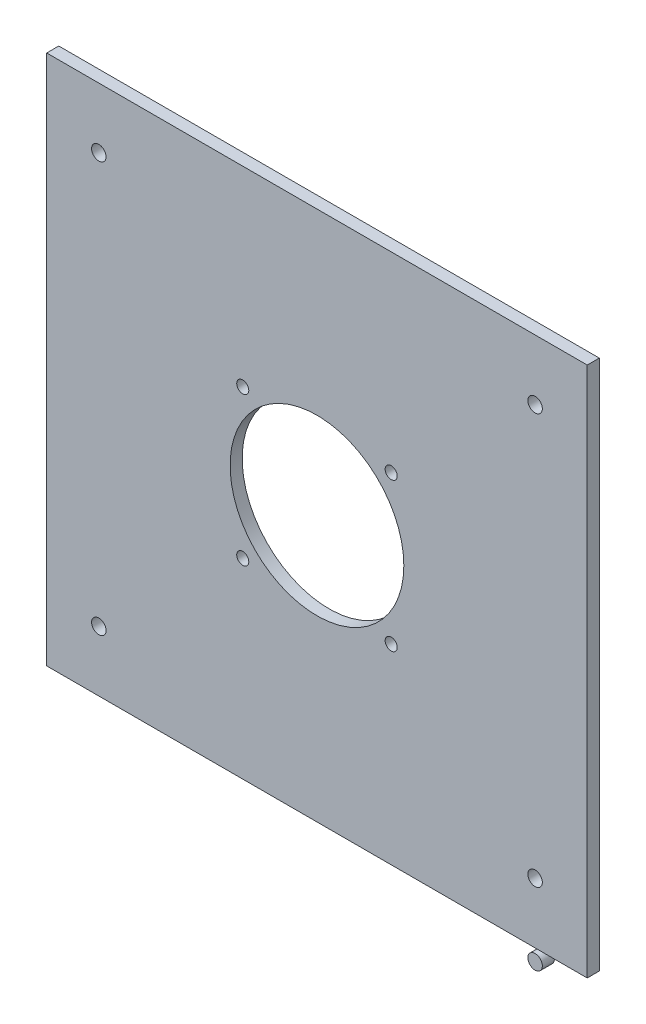
ISO-10303-21;
HEADER;
FILE_DESCRIPTION(('STEP AP214'),'2;1');
FILE_NAME('part.step','',(''),(''),'','','');
FILE_SCHEMA(('AUTOMOTIVE_DESIGN { 1 0 10303 214 1 1 1 1 }'));
ENDSEC;
DATA;
#1=APPLICATION_CONTEXT('core data for automotive mechanical design processes');
#2=APPLICATION_PROTOCOL_DEFINITION('international standard','automotive_design',2000,#1);
#3=PRODUCT_CONTEXT('',#1,'mechanical');
#4=PRODUCT('Part','Part','',(#3));
#5=PRODUCT_RELATED_PRODUCT_CATEGORY('part','',(#4));
#6=PRODUCT_DEFINITION_FORMATION('','',#4);
#7=PRODUCT_DEFINITION_CONTEXT('part definition',#1,'design');
#8=PRODUCT_DEFINITION('design','',#6,#7);
#9=PRODUCT_DEFINITION_SHAPE('','',#8);
#10=(LENGTH_UNIT() NAMED_UNIT(*) SI_UNIT(.MILLI.,.METRE.));
#11=(NAMED_UNIT(*) PLANE_ANGLE_UNIT() SI_UNIT($,.RADIAN.));
#12=(NAMED_UNIT(*) SI_UNIT($,.STERADIAN.) SOLID_ANGLE_UNIT());
#13=UNCERTAINTY_MEASURE_WITH_UNIT(LENGTH_MEASURE(1.E-05),#10,'distance_accuracy_value','');
#14=(GEOMETRIC_REPRESENTATION_CONTEXT(3) GLOBAL_UNCERTAINTY_ASSIGNED_CONTEXT((#13)) GLOBAL_UNIT_ASSIGNED_CONTEXT((#10,
#11,#12)) REPRESENTATION_CONTEXT('',''));
#15=CARTESIAN_POINT('',(0.,0.,0.));
#16=DIRECTION('',(0.,0.,1.));
#17=DIRECTION('',(1.,0.,0.));
#18=AXIS2_PLACEMENT_3D('',#15,#16,#17);
#19=CARTESIAN_POINT('',(452.,-575.,25.));
#20=DIRECTION('',(0.,0.,-1.));
#21=DIRECTION('',(-1.,0.,0.));
#22=AXIS2_PLACEMENT_3D('',#19,#20,#21);
#23=CYLINDRICAL_SURFACE('',#22,15.);
#24=CARTESIAN_POINT('',(452.,-575.,25.));
#25=DIRECTION('',(0.,0.,1.));
#26=DIRECTION('',(1.,0.,0.));
#27=AXIS2_PLACEMENT_3D('',#24,#25,#26);
#28=CIRCLE('',#27,15.);
#29=CARTESIAN_POINT('',(467.,-575.,25.));
#30=VERTEX_POINT('',#29);
#31=EDGE_CURVE('E11',#30,#30,#28,.T.);
#32=ORIENTED_EDGE('',*,*,#31,.F.);
#33=EDGE_LOOP('',(#32));
#34=FACE_BOUND('',#33,.T.);
#35=CARTESIAN_POINT('',(452.,-575.,0.));
#36=DIRECTION('',(0.,0.,1.));
#37=DIRECTION('',(1.,0.,0.));
#38=AXIS2_PLACEMENT_3D('',#35,#36,#37);
#39=CIRCLE('',#38,15.);
#40=CARTESIAN_POINT('',(467.,-575.,0.));
#41=VERTEX_POINT('',#40);
#42=EDGE_CURVE('E47',#41,#41,#39,.T.);
#43=ORIENTED_EDGE('',*,*,#42,.T.);
#44=EDGE_LOOP('',(#43));
#45=FACE_BOUND('',#44,.T.);
#46=ADVANCED_FACE('F44',(#34,#45),#23,.T.);
#47=CARTESIAN_POINT('',(452.,-575.,25.));
#48=DIRECTION('',(0.,0.,1.));
#49=DIRECTION('',(1.,0.,0.));
#50=AXIS2_PLACEMENT_3D('',#47,#48,#49);
#51=PLANE('',#50);
#52=ORIENTED_EDGE('',*,*,#31,.T.);
#53=EDGE_LOOP('',(#52));
#54=FACE_BOUND('',#53,.T.);
#55=ADVANCED_FACE('F59',(#54),#51,.T.);
#56=CARTESIAN_POINT('',(452.,-575.,0.));
#57=DIRECTION('',(0.,0.,1.));
#58=DIRECTION('',(1.,0.,0.));
#59=AXIS2_PLACEMENT_3D('',#56,#57,#58);
#60=PLANE('',#59);
#61=ORIENTED_EDGE('',*,*,#42,.F.);
#62=EDGE_LOOP('',(#61));
#63=FACE_BOUND('',#62,.T.);
#64=ADVANCED_FACE('F57',(#63),#60,.F.);
#65=CLOSED_SHELL('',(#46,#55,#64));
#66=MANIFOLD_SOLID_BREP('B2',#65);
#67=CARTESIAN_POINT('',(0.,0.,25.));
#68=DIRECTION('',(0.,0.,-1.));
#69=DIRECTION('',(-1.,0.,0.));
#70=AXIS2_PLACEMENT_3D('',#67,#68,#69);
#71=PLANE('',#70);
#72=CARTESIAN_POINT('',(452.,-425.,25.));
#73=DIRECTION('',(0.,0.,-1.));
#74=DIRECTION('',(-1.,0.,0.));
#75=AXIS2_PLACEMENT_3D('',#72,#73,#74);
#76=CIRCLE('',#75,15.);
#77=CARTESIAN_POINT('',(437.,-425.,25.));
#78=VERTEX_POINT('',#77);
#79=EDGE_CURVE('E212',#78,#78,#76,.T.);
#80=ORIENTED_EDGE('',*,*,#79,.T.);
#81=EDGE_LOOP('',(#80));
#82=FACE_BOUND('',#81,.T.);
#83=CARTESIAN_POINT('',(-452.,-425.,25.));
#84=DIRECTION('',(0.,0.,-1.));
#85=DIRECTION('',(-1.,0.,0.));
#86=AXIS2_PLACEMENT_3D('',#83,#84,#85);
#87=CIRCLE('',#86,15.);
#88=CARTESIAN_POINT('',(-467.,-425.,25.));
#89=VERTEX_POINT('',#88);
#90=EDGE_CURVE('E206',#89,#89,#87,.T.);
#91=ORIENTED_EDGE('',*,*,#90,.T.);
#92=EDGE_LOOP('',(#91));
#93=FACE_BOUND('',#92,.T.);
#94=CARTESIAN_POINT('',(452.,425.,25.));
#95=DIRECTION('',(0.,0.,1.));
#96=DIRECTION('',(1.,0.,0.));
#97=AXIS2_PLACEMENT_3D('',#94,#95,#96);
#98=CIRCLE('',#97,15.);
#99=CARTESIAN_POINT('',(467.,425.,25.));
#100=VERTEX_POINT('',#99);
#101=EDGE_CURVE('E194',#100,#100,#98,.T.);
#102=ORIENTED_EDGE('',*,*,#101,.F.);
#103=EDGE_LOOP('',(#102));
#104=FACE_BOUND('',#103,.T.);
#105=CARTESIAN_POINT('',(-153.795724908077,-153.795724908072,25.));
#106=DIRECTION('',(0.,0.,1.));
#107=DIRECTION('',(1.,0.,0.));
#108=AXIS2_PLACEMENT_3D('',#105,#106,#107);
#109=CIRCLE('',#108,12.5);
#110=CARTESIAN_POINT('',(-141.295724908077,-153.795724908072,25.));
#111=VERTEX_POINT('',#110);
#112=EDGE_CURVE('E182',#111,#111,#109,.T.);
#113=ORIENTED_EDGE('',*,*,#112,.F.);
#114=EDGE_LOOP('',(#113));
#115=FACE_BOUND('',#114,.T.);
#116=CARTESIAN_POINT('',(0.,-1.78069778805354E-13,25.));
#117=DIRECTION('',(0.,0.,1.));
#118=DIRECTION('',(1.,0.,0.));
#119=AXIS2_PLACEMENT_3D('',#116,#117,#118);
#120=CIRCLE('',#119,180.);
#121=CARTESIAN_POINT('',(180.,-1.78069778805354E-13,25.));
#122=VERTEX_POINT('',#121);
#123=EDGE_CURVE('E170',#122,#122,#120,.T.);
#124=ORIENTED_EDGE('',*,*,#123,.F.);
#125=EDGE_LOOP('',(#124));
#126=FACE_BOUND('',#125,.T.);
#127=DIRECTION('',(0.,1.,0.));
#128=VECTOR('',#127,1.);
#129=CARTESIAN_POINT('',(560.,-550.,25.));
#130=LINE('',#129,#128);
#131=CARTESIAN_POINT('',(560.,-550.,25.));
#132=VERTEX_POINT('',#131);
#133=CARTESIAN_POINT('',(560.,550.,25.));
#134=VERTEX_POINT('',#133);
#135=EDGE_CURVE('E140',#132,#134,#130,.T.);
#136=ORIENTED_EDGE('',*,*,#135,.T.);
#137=DIRECTION('',(-1.,0.,0.));
#138=VECTOR('',#137,1.);
#139=CARTESIAN_POINT('',(-560.,550.,25.));
#140=LINE('',#139,#138);
#141=CARTESIAN_POINT('',(-560.,550.,25.));
#142=VERTEX_POINT('',#141);
#143=EDGE_CURVE('E135',#134,#142,#140,.T.);
#144=ORIENTED_EDGE('',*,*,#143,.T.);
#145=DIRECTION('',(0.,-1.,0.));
#146=VECTOR('',#145,1.);
#147=CARTESIAN_POINT('',(-560.,-550.,25.));
#148=LINE('',#147,#146);
#149=CARTESIAN_POINT('',(-560.,-550.,25.));
#150=VERTEX_POINT('',#149);
#151=EDGE_CURVE('E138',#142,#150,#148,.T.);
#152=ORIENTED_EDGE('',*,*,#151,.T.);
#153=DIRECTION('',(1.,0.,0.));
#154=VECTOR('',#153,1.);
#155=CARTESIAN_POINT('',(-560.,-550.,25.));
#156=LINE('',#155,#154);
#157=EDGE_CURVE('E105',#150,#132,#156,.T.);
#158=ORIENTED_EDGE('',*,*,#157,.T.);
#159=EDGE_LOOP('',(#136,#144,#152,#158));
#160=FACE_BOUND('',#159,.T.);
#161=CARTESIAN_POINT('',(-452.,425.,25.));
#162=DIRECTION('',(0.,0.,1.));
#163=DIRECTION('',(1.,0.,0.));
#164=AXIS2_PLACEMENT_3D('',#161,#162,#163);
#165=CIRCLE('',#164,15.);
#166=CARTESIAN_POINT('',(-437.,425.,25.));
#167=VERTEX_POINT('',#166);
#168=EDGE_CURVE('E155',#167,#167,#165,.T.);
#169=ORIENTED_EDGE('',*,*,#168,.F.);
#170=EDGE_LOOP('',(#169));
#171=FACE_BOUND('',#170,.T.);
#172=CARTESIAN_POINT('',(153.795724908074,-153.795724908074,25.));
#173=DIRECTION('',(0.,0.,1.));
#174=DIRECTION('',(1.,0.,0.));
#175=AXIS2_PLACEMENT_3D('',#172,#173,#174);
#176=CIRCLE('',#175,12.5);
#177=CARTESIAN_POINT('',(166.295724908074,-153.795724908074,25.));
#178=VERTEX_POINT('',#177);
#179=EDGE_CURVE('E176',#178,#178,#176,.T.);
#180=ORIENTED_EDGE('',*,*,#179,.F.);
#181=EDGE_LOOP('',(#180));
#182=FACE_BOUND('',#181,.T.);
#183=CARTESIAN_POINT('',(-153.795724908071,153.795724908077,25.));
#184=DIRECTION('',(0.,0.,1.));
#185=DIRECTION('',(1.,0.,0.));
#186=AXIS2_PLACEMENT_3D('',#183,#184,#185);
#187=CIRCLE('',#186,12.5);
#188=CARTESIAN_POINT('',(-141.295724908071,153.795724908077,25.));
#189=VERTEX_POINT('',#188);
#190=EDGE_CURVE('E188',#189,#189,#187,.T.);
#191=ORIENTED_EDGE('',*,*,#190,.F.);
#192=EDGE_LOOP('',(#191));
#193=FACE_BOUND('',#192,.T.);
#194=CARTESIAN_POINT('',(153.795724908078,153.795724908071,25.));
#195=DIRECTION('',(0.,0.,1.));
#196=DIRECTION('',(1.,0.,0.));
#197=AXIS2_PLACEMENT_3D('',#194,#195,#196);
#198=CIRCLE('',#197,12.5);
#199=CARTESIAN_POINT('',(166.295724908078,153.795724908071,25.));
#200=VERTEX_POINT('',#199);
#201=EDGE_CURVE('E200',#200,#200,#198,.T.);
#202=ORIENTED_EDGE('',*,*,#201,.F.);
#203=EDGE_LOOP('',(#202));
#204=FACE_BOUND('',#203,.T.);
#205=ADVANCED_FACE('F88',(#82,#93,#104,#115,#126,#160,#171,#182,#193,#204),#71,.F.);
#206=CARTESIAN_POINT('',(0.,0.,0.));
#207=DIRECTION('',(0.,0.,-1.));
#208=DIRECTION('',(-1.,0.,0.));
#209=AXIS2_PLACEMENT_3D('',#206,#207,#208);
#210=PLANE('',#209);
#211=CARTESIAN_POINT('',(452.,-425.,0.));
#212=DIRECTION('',(0.,0.,-1.));
#213=DIRECTION('',(-1.,0.,0.));
#214=AXIS2_PLACEMENT_3D('',#211,#212,#213);
#215=CIRCLE('',#214,15.);
#216=CARTESIAN_POINT('',(437.,-425.,0.));
#217=VERTEX_POINT('',#216);
#218=EDGE_CURVE('E215',#217,#217,#215,.T.);
#219=ORIENTED_EDGE('',*,*,#218,.F.);
#220=EDGE_LOOP('',(#219));
#221=FACE_BOUND('',#220,.T.);
#222=CARTESIAN_POINT('',(-452.,-425.,0.));
#223=DIRECTION('',(0.,0.,-1.));
#224=DIRECTION('',(-1.,0.,0.));
#225=AXIS2_PLACEMENT_3D('',#222,#223,#224);
#226=CIRCLE('',#225,15.);
#227=CARTESIAN_POINT('',(-467.,-425.,0.));
#228=VERTEX_POINT('',#227);
#229=EDGE_CURVE('E209',#228,#228,#226,.T.);
#230=ORIENTED_EDGE('',*,*,#229,.F.);
#231=EDGE_LOOP('',(#230));
#232=FACE_BOUND('',#231,.T.);
#233=CARTESIAN_POINT('',(452.,425.,0.));
#234=DIRECTION('',(0.,0.,1.));
#235=DIRECTION('',(1.,0.,0.));
#236=AXIS2_PLACEMENT_3D('',#233,#234,#235);
#237=CIRCLE('',#236,15.);
#238=CARTESIAN_POINT('',(467.,425.,0.));
#239=VERTEX_POINT('',#238);
#240=EDGE_CURVE('E197',#239,#239,#237,.T.);
#241=ORIENTED_EDGE('',*,*,#240,.T.);
#242=EDGE_LOOP('',(#241));
#243=FACE_BOUND('',#242,.T.);
#244=CARTESIAN_POINT('',(-153.795724908077,-153.795724908072,0.));
#245=DIRECTION('',(0.,0.,1.));
#246=DIRECTION('',(1.,0.,0.));
#247=AXIS2_PLACEMENT_3D('',#244,#245,#246);
#248=CIRCLE('',#247,12.5);
#249=CARTESIAN_POINT('',(-141.295724908077,-153.795724908072,0.));
#250=VERTEX_POINT('',#249);
#251=EDGE_CURVE('E185',#250,#250,#248,.T.);
#252=ORIENTED_EDGE('',*,*,#251,.T.);
#253=EDGE_LOOP('',(#252));
#254=FACE_BOUND('',#253,.T.);
#255=CARTESIAN_POINT('',(0.,-1.78069778805354E-13,0.));
#256=DIRECTION('',(0.,0.,1.));
#257=DIRECTION('',(1.,0.,0.));
#258=AXIS2_PLACEMENT_3D('',#255,#256,#257);
#259=CIRCLE('',#258,180.);
#260=CARTESIAN_POINT('',(180.,-1.78069778805354E-13,0.));
#261=VERTEX_POINT('',#260);
#262=EDGE_CURVE('E173',#261,#261,#259,.T.);
#263=ORIENTED_EDGE('',*,*,#262,.T.);
#264=EDGE_LOOP('',(#263));
#265=FACE_BOUND('',#264,.T.);
#266=DIRECTION('',(0.,1.,0.));
#267=VECTOR('',#266,1.);
#268=CARTESIAN_POINT('',(560.,-550.,0.));
#269=LINE('',#268,#267);
#270=CARTESIAN_POINT('',(560.,-550.,0.));
#271=VERTEX_POINT('',#270);
#272=CARTESIAN_POINT('',(560.,550.,0.));
#273=VERTEX_POINT('',#272);
#274=EDGE_CURVE('E152',#271,#273,#269,.T.);
#275=ORIENTED_EDGE('',*,*,#274,.F.);
#276=DIRECTION('',(1.,0.,0.));
#277=VECTOR('',#276,1.);
#278=CARTESIAN_POINT('',(-560.,-550.,0.));
#279=LINE('',#278,#277);
#280=CARTESIAN_POINT('',(-560.,-550.,0.));
#281=VERTEX_POINT('',#280);
#282=EDGE_CURVE('E128',#281,#271,#279,.T.);
#283=ORIENTED_EDGE('',*,*,#282,.F.);
#284=DIRECTION('',(0.,-1.,0.));
#285=VECTOR('',#284,1.);
#286=CARTESIAN_POINT('',(-560.,-550.,0.));
#287=LINE('',#286,#285);
#288=CARTESIAN_POINT('',(-560.,550.,0.));
#289=VERTEX_POINT('',#288);
#290=EDGE_CURVE('E122',#289,#281,#287,.T.);
#291=ORIENTED_EDGE('',*,*,#290,.F.);
#292=DIRECTION('',(-1.,0.,0.));
#293=VECTOR('',#292,1.);
#294=CARTESIAN_POINT('',(-560.,550.,0.));
#295=LINE('',#294,#293);
#296=EDGE_CURVE('E144',#273,#289,#295,.T.);
#297=ORIENTED_EDGE('',*,*,#296,.F.);
#298=EDGE_LOOP('',(#275,#283,#291,#297));
#299=FACE_BOUND('',#298,.T.);
#300=CARTESIAN_POINT('',(-452.,425.,0.));
#301=DIRECTION('',(0.,0.,1.));
#302=DIRECTION('',(1.,0.,0.));
#303=AXIS2_PLACEMENT_3D('',#300,#301,#302);
#304=CIRCLE('',#303,15.);
#305=CARTESIAN_POINT('',(-437.,425.,0.));
#306=VERTEX_POINT('',#305);
#307=EDGE_CURVE('E167',#306,#306,#304,.T.);
#308=ORIENTED_EDGE('',*,*,#307,.T.);
#309=EDGE_LOOP('',(#308));
#310=FACE_BOUND('',#309,.T.);
#311=CARTESIAN_POINT('',(153.795724908074,-153.795724908074,0.));
#312=DIRECTION('',(0.,0.,1.));
#313=DIRECTION('',(1.,0.,0.));
#314=AXIS2_PLACEMENT_3D('',#311,#312,#313);
#315=CIRCLE('',#314,12.5);
#316=CARTESIAN_POINT('',(166.295724908074,-153.795724908074,0.));
#317=VERTEX_POINT('',#316);
#318=EDGE_CURVE('E179',#317,#317,#315,.T.);
#319=ORIENTED_EDGE('',*,*,#318,.T.);
#320=EDGE_LOOP('',(#319));
#321=FACE_BOUND('',#320,.T.);
#322=CARTESIAN_POINT('',(-153.795724908071,153.795724908077,0.));
#323=DIRECTION('',(0.,0.,1.));
#324=DIRECTION('',(1.,0.,0.));
#325=AXIS2_PLACEMENT_3D('',#322,#323,#324);
#326=CIRCLE('',#325,12.5);
#327=CARTESIAN_POINT('',(-141.295724908071,153.795724908077,0.));
#328=VERTEX_POINT('',#327);
#329=EDGE_CURVE('E191',#328,#328,#326,.T.);
#330=ORIENTED_EDGE('',*,*,#329,.T.);
#331=EDGE_LOOP('',(#330));
#332=FACE_BOUND('',#331,.T.);
#333=CARTESIAN_POINT('',(153.795724908078,153.795724908071,0.));
#334=DIRECTION('',(0.,0.,1.));
#335=DIRECTION('',(1.,0.,0.));
#336=AXIS2_PLACEMENT_3D('',#333,#334,#335);
#337=CIRCLE('',#336,12.5);
#338=CARTESIAN_POINT('',(166.295724908078,153.795724908071,0.));
#339=VERTEX_POINT('',#338);
#340=EDGE_CURVE('E203',#339,#339,#337,.T.);
#341=ORIENTED_EDGE('',*,*,#340,.T.);
#342=EDGE_LOOP('',(#341));
#343=FACE_BOUND('',#342,.T.);
#344=ADVANCED_FACE('F163',(#221,#232,#243,#254,#265,#299,#310,#321,#332,#343),#210,.T.);
#345=CARTESIAN_POINT('',(560.,-550.,25.));
#346=DIRECTION('',(-1.,0.,0.));
#347=DIRECTION('',(0.,0.,1.));
#348=AXIS2_PLACEMENT_3D('',#345,#346,#347);
#349=PLANE('',#348);
#350=ORIENTED_EDGE('',*,*,#274,.T.);
#351=DIRECTION('',(0.,0.,-1.));
#352=VECTOR('',#351,1.);
#353=CARTESIAN_POINT('',(560.,550.,25.));
#354=LINE('',#353,#352);
#355=EDGE_CURVE('E42',#134,#273,#354,.T.);
#356=ORIENTED_EDGE('',*,*,#355,.F.);
#357=ORIENTED_EDGE('',*,*,#135,.F.);
#358=DIRECTION('',(0.,0.,-1.));
#359=VECTOR('',#358,1.);
#360=CARTESIAN_POINT('',(560.,-550.,25.));
#361=LINE('',#360,#359);
#362=EDGE_CURVE('E148',#132,#271,#361,.T.);
#363=ORIENTED_EDGE('',*,*,#362,.T.);
#364=EDGE_LOOP('',(#350,#356,#357,#363));
#365=FACE_BOUND('',#364,.T.);
#366=ADVANCED_FACE('F90',(#365),#349,.F.);
#367=CARTESIAN_POINT('',(-560.,550.,25.));
#368=DIRECTION('',(0.,-1.,0.));
#369=DIRECTION('',(1.,0.,0.));
#370=AXIS2_PLACEMENT_3D('',#367,#368,#369);
#371=PLANE('',#370);
#372=ORIENTED_EDGE('',*,*,#296,.T.);
#373=DIRECTION('',(0.,0.,-1.));
#374=VECTOR('',#373,1.);
#375=CARTESIAN_POINT('',(-560.,550.,25.));
#376=LINE('',#375,#374);
#377=EDGE_CURVE('E97',#142,#289,#376,.T.);
#378=ORIENTED_EDGE('',*,*,#377,.F.);
#379=ORIENTED_EDGE('',*,*,#143,.F.);
#380=ORIENTED_EDGE('',*,*,#355,.T.);
#381=EDGE_LOOP('',(#372,#378,#379,#380));
#382=FACE_BOUND('',#381,.T.);
#383=ADVANCED_FACE('F143',(#382),#371,.F.);
#384=CARTESIAN_POINT('',(-560.,-550.,25.));
#385=DIRECTION('',(1.,0.,0.));
#386=DIRECTION('',(0.,1.,0.));
#387=AXIS2_PLACEMENT_3D('',#384,#385,#386);
#388=PLANE('',#387);
#389=ORIENTED_EDGE('',*,*,#290,.T.);
#390=DIRECTION('',(0.,0.,-1.));
#391=VECTOR('',#390,1.);
#392=CARTESIAN_POINT('',(-560.,-550.,25.));
#393=LINE('',#392,#391);
#394=EDGE_CURVE('E145',#150,#281,#393,.T.);
#395=ORIENTED_EDGE('',*,*,#394,.F.);
#396=ORIENTED_EDGE('',*,*,#151,.F.);
#397=ORIENTED_EDGE('',*,*,#377,.T.);
#398=EDGE_LOOP('',(#389,#395,#396,#397));
#399=FACE_BOUND('',#398,.T.);
#400=ADVANCED_FACE('F146',(#399),#388,.F.);
#401=CARTESIAN_POINT('',(-560.,-550.,25.));
#402=DIRECTION('',(0.,1.,0.));
#403=DIRECTION('',(0.,0.,1.));
#404=AXIS2_PLACEMENT_3D('',#401,#402,#403);
#405=PLANE('',#404);
#406=ORIENTED_EDGE('',*,*,#282,.T.);
#407=ORIENTED_EDGE('',*,*,#362,.F.);
#408=ORIENTED_EDGE('',*,*,#157,.F.);
#409=ORIENTED_EDGE('',*,*,#394,.T.);
#410=EDGE_LOOP('',(#406,#407,#408,#409));
#411=FACE_BOUND('',#410,.T.);
#412=ADVANCED_FACE('F160',(#411),#405,.F.);
#413=CARTESIAN_POINT('',(-452.,425.,25.));
#414=DIRECTION('',(0.,0.,-1.));
#415=DIRECTION('',(-1.,0.,0.));
#416=AXIS2_PLACEMENT_3D('',#413,#414,#415);
#417=CYLINDRICAL_SURFACE('',#416,15.);
#418=ORIENTED_EDGE('',*,*,#168,.T.);
#419=EDGE_LOOP('',(#418));
#420=FACE_BOUND('',#419,.T.);
#421=ORIENTED_EDGE('',*,*,#307,.F.);
#422=EDGE_LOOP('',(#421));
#423=FACE_BOUND('',#422,.T.);
#424=ADVANCED_FACE('F244',(#420,#423),#417,.F.);
#425=CARTESIAN_POINT('',(0.,-1.78069778805354E-13,25.));
#426=DIRECTION('',(0.,0.,-1.));
#427=DIRECTION('',(-1.,0.,0.));
#428=AXIS2_PLACEMENT_3D('',#425,#426,#427);
#429=CYLINDRICAL_SURFACE('',#428,180.);
#430=ORIENTED_EDGE('',*,*,#123,.T.);
#431=EDGE_LOOP('',(#430));
#432=FACE_BOUND('',#431,.T.);
#433=ORIENTED_EDGE('',*,*,#262,.F.);
#434=EDGE_LOOP('',(#433));
#435=FACE_BOUND('',#434,.T.);
#436=ADVANCED_FACE('F241',(#432,#435),#429,.F.);
#437=CARTESIAN_POINT('',(153.795724908074,-153.795724908074,25.));
#438=DIRECTION('',(0.,0.,-1.));
#439=DIRECTION('',(-1.,0.,0.));
#440=AXIS2_PLACEMENT_3D('',#437,#438,#439);
#441=CYLINDRICAL_SURFACE('',#440,12.5);
#442=ORIENTED_EDGE('',*,*,#179,.T.);
#443=EDGE_LOOP('',(#442));
#444=FACE_BOUND('',#443,.T.);
#445=ORIENTED_EDGE('',*,*,#318,.F.);
#446=EDGE_LOOP('',(#445));
#447=FACE_BOUND('',#446,.T.);
#448=ADVANCED_FACE('F243',(#444,#447),#441,.F.);
#449=CARTESIAN_POINT('',(-153.795724908077,-153.795724908072,25.));
#450=DIRECTION('',(0.,0.,-1.));
#451=DIRECTION('',(-1.,0.,0.));
#452=AXIS2_PLACEMENT_3D('',#449,#450,#451);
#453=CYLINDRICAL_SURFACE('',#452,12.5);
#454=ORIENTED_EDGE('',*,*,#112,.T.);
#455=EDGE_LOOP('',(#454));
#456=FACE_BOUND('',#455,.T.);
#457=ORIENTED_EDGE('',*,*,#251,.F.);
#458=EDGE_LOOP('',(#457));
#459=FACE_BOUND('',#458,.T.);
#460=ADVANCED_FACE('F251',(#456,#459),#453,.F.);
#461=CARTESIAN_POINT('',(-153.795724908071,153.795724908077,25.));
#462=DIRECTION('',(0.,0.,-1.));
#463=DIRECTION('',(-1.,0.,0.));
#464=AXIS2_PLACEMENT_3D('',#461,#462,#463);
#465=CYLINDRICAL_SURFACE('',#464,12.5);
#466=ORIENTED_EDGE('',*,*,#190,.T.);
#467=EDGE_LOOP('',(#466));
#468=FACE_BOUND('',#467,.T.);
#469=ORIENTED_EDGE('',*,*,#329,.F.);
#470=EDGE_LOOP('',(#469));
#471=FACE_BOUND('',#470,.T.);
#472=ADVANCED_FACE('F303',(#468,#471),#465,.F.);
#473=CARTESIAN_POINT('',(452.,425.,25.));
#474=DIRECTION('',(0.,0.,-1.));
#475=DIRECTION('',(-1.,0.,0.));
#476=AXIS2_PLACEMENT_3D('',#473,#474,#475);
#477=CYLINDRICAL_SURFACE('',#476,15.);
#478=ORIENTED_EDGE('',*,*,#101,.T.);
#479=EDGE_LOOP('',(#478));
#480=FACE_BOUND('',#479,.T.);
#481=ORIENTED_EDGE('',*,*,#240,.F.);
#482=EDGE_LOOP('',(#481));
#483=FACE_BOUND('',#482,.T.);
#484=ADVANCED_FACE('F313',(#480,#483),#477,.F.);
#485=CARTESIAN_POINT('',(153.795724908078,153.795724908071,25.));
#486=DIRECTION('',(0.,0.,-1.));
#487=DIRECTION('',(-1.,0.,0.));
#488=AXIS2_PLACEMENT_3D('',#485,#486,#487);
#489=CYLINDRICAL_SURFACE('',#488,12.5);
#490=ORIENTED_EDGE('',*,*,#201,.T.);
#491=EDGE_LOOP('',(#490));
#492=FACE_BOUND('',#491,.T.);
#493=ORIENTED_EDGE('',*,*,#340,.F.);
#494=EDGE_LOOP('',(#493));
#495=FACE_BOUND('',#494,.T.);
#496=ADVANCED_FACE('F323',(#492,#495),#489,.F.);
#497=CARTESIAN_POINT('',(-452.,-425.,25.));
#498=DIRECTION('',(0.,0.,-1.));
#499=DIRECTION('',(-1.,0.,0.));
#500=AXIS2_PLACEMENT_3D('',#497,#498,#499);
#501=CYLINDRICAL_SURFACE('',#500,15.);
#502=ORIENTED_EDGE('',*,*,#90,.F.);
#503=EDGE_LOOP('',(#502));
#504=FACE_BOUND('',#503,.T.);
#505=ORIENTED_EDGE('',*,*,#229,.T.);
#506=EDGE_LOOP('',(#505));
#507=FACE_BOUND('',#506,.T.);
#508=ADVANCED_FACE('F226',(#504,#507),#501,.F.);
#509=CARTESIAN_POINT('',(452.,-425.,25.));
#510=DIRECTION('',(0.,0.,-1.));
#511=DIRECTION('',(-1.,0.,0.));
#512=AXIS2_PLACEMENT_3D('',#509,#510,#511);
#513=CYLINDRICAL_SURFACE('',#512,15.);
#514=ORIENTED_EDGE('',*,*,#79,.F.);
#515=EDGE_LOOP('',(#514));
#516=FACE_BOUND('',#515,.T.);
#517=ORIENTED_EDGE('',*,*,#218,.T.);
#518=EDGE_LOOP('',(#517));
#519=FACE_BOUND('',#518,.T.);
#520=ADVANCED_FACE('F223',(#516,#519),#513,.F.);
#521=CLOSED_SHELL('',(#205,#344,#366,#383,#400,#412,#424,#436,#448,#460,#472,#484,#496,#508,#520));
#522=MANIFOLD_SOLID_BREP('B6',#521);
#523=ADVANCED_BREP_SHAPE_REPRESENTATION('',(#18,#66,#522),#14);
#524=SHAPE_DEFINITION_REPRESENTATION(#9,#523);
ENDSEC;
END-ISO-10303-21;
